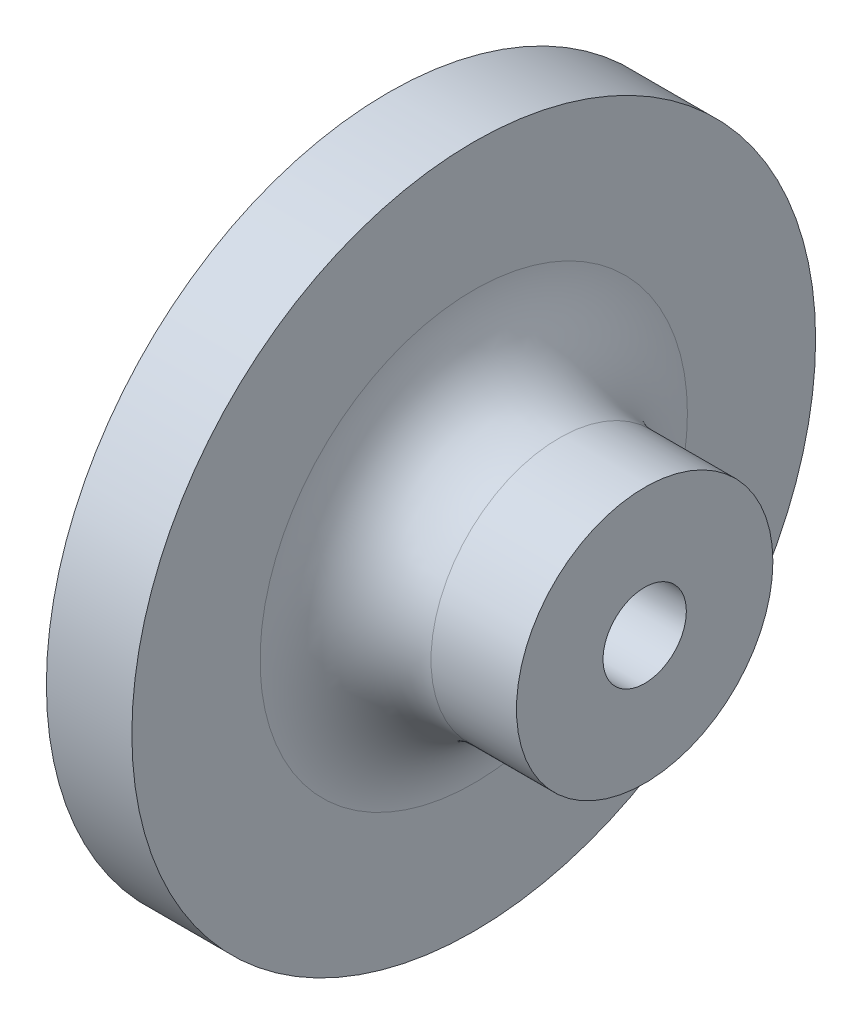
ISO-10303-21;
HEADER;
FILE_DESCRIPTION(('STEP AP214'),'2;1');
FILE_NAME('part.step','',(''),(''),'','','');
FILE_SCHEMA(('AUTOMOTIVE_DESIGN { 1 0 10303 214 1 1 1 1 }'));
ENDSEC;
DATA;
#1=APPLICATION_CONTEXT('core data for automotive mechanical design processes');
#2=APPLICATION_PROTOCOL_DEFINITION('international standard','automotive_design',2000,#1);
#3=PRODUCT_CONTEXT('',#1,'mechanical');
#4=PRODUCT('Part','Part','',(#3));
#5=PRODUCT_RELATED_PRODUCT_CATEGORY('part','',(#4));
#6=PRODUCT_DEFINITION_FORMATION('','',#4);
#7=PRODUCT_DEFINITION_CONTEXT('part definition',#1,'design');
#8=PRODUCT_DEFINITION('design','',#6,#7);
#9=PRODUCT_DEFINITION_SHAPE('','',#8);
#10=(LENGTH_UNIT() NAMED_UNIT(*) SI_UNIT(.MILLI.,.METRE.));
#11=(NAMED_UNIT(*) PLANE_ANGLE_UNIT() SI_UNIT($,.RADIAN.));
#12=(NAMED_UNIT(*) SI_UNIT($,.STERADIAN.) SOLID_ANGLE_UNIT());
#13=UNCERTAINTY_MEASURE_WITH_UNIT(LENGTH_MEASURE(1.E-05),#10,'distance_accuracy_value','');
#14=(GEOMETRIC_REPRESENTATION_CONTEXT(3) GLOBAL_UNCERTAINTY_ASSIGNED_CONTEXT((#13)) GLOBAL_UNIT_ASSIGNED_CONTEXT((#10,
#11,#12)) REPRESENTATION_CONTEXT('',''));
#15=CARTESIAN_POINT('',(0.,0.,0.));
#16=DIRECTION('',(0.,0.,1.));
#17=DIRECTION('',(1.,0.,0.));
#18=AXIS2_PLACEMENT_3D('',#15,#16,#17);
#19=CARTESIAN_POINT('',(10.,0.,32.));
#20=DIRECTION('',(-1.,0.,0.));
#21=DIRECTION('',(0.,0.,1.));
#22=AXIS2_PLACEMENT_3D('',#19,#20,#21);
#23=CYLINDRICAL_SURFACE('',#22,5.5);
#24=CARTESIAN_POINT('',(0.,0.,32.));
#25=DIRECTION('',(1.,0.,0.));
#26=DIRECTION('',(0.,0.,-1.));
#27=AXIS2_PLACEMENT_3D('',#24,#25,#26);
#28=CIRCLE('',#27,5.5);
#29=CARTESIAN_POINT('',(0.,0.,26.5));
#30=VERTEX_POINT('',#29);
#31=EDGE_CURVE('E61',#30,#30,#28,.T.);
#32=ORIENTED_EDGE('',*,*,#31,.F.);
#33=EDGE_LOOP('',(#32));
#34=FACE_BOUND('',#33,.T.);
#35=CARTESIAN_POINT('',(3.,0.,32.));
#36=DIRECTION('',(1.,0.,0.));
#37=DIRECTION('',(0.,0.,-1.));
#38=AXIS2_PLACEMENT_3D('',#35,#36,#37);
#39=CIRCLE('',#38,5.5);
#40=CARTESIAN_POINT('',(3.,0.,26.5));
#41=VERTEX_POINT('',#40);
#42=EDGE_CURVE('E146',#41,#41,#39,.T.);
#43=ORIENTED_EDGE('',*,*,#42,.T.);
#44=EDGE_LOOP('',(#43));
#45=FACE_BOUND('',#44,.T.);
#46=ADVANCED_FACE('F37',(#34,#45),#23,.F.);
#47=CARTESIAN_POINT('',(10.,-11.4292607123503,17.1050974451097));
#48=DIRECTION('',(-1.,0.,0.));
#49=DIRECTION('',(0.,0.,1.));
#50=AXIS2_PLACEMENT_3D('',#47,#48,#49);
#51=CYLINDRICAL_SURFACE('',#50,5.5);
#52=CARTESIAN_POINT('',(0.,-11.4292607123503,17.1050974451097));
#53=DIRECTION('',(1.,0.,0.));
#54=DIRECTION('',(0.,0.,-1.));
#55=AXIS2_PLACEMENT_3D('',#52,#53,#54);
#56=CIRCLE('',#55,5.5);
#57=CARTESIAN_POINT('',(0.,-11.4292607123503,11.6050974451097));
#58=VERTEX_POINT('',#57);
#59=EDGE_CURVE('E65',#58,#58,#56,.T.);
#60=ORIENTED_EDGE('',*,*,#59,.F.);
#61=EDGE_LOOP('',(#60));
#62=FACE_BOUND('',#61,.T.);
#63=CARTESIAN_POINT('',(3.,-11.4292607123503,17.1050974451097));
#64=DIRECTION('',(1.,0.,0.));
#65=DIRECTION('',(0.,0.,-1.));
#66=AXIS2_PLACEMENT_3D('',#63,#64,#65);
#67=CIRCLE('',#66,5.5);
#68=CARTESIAN_POINT('',(3.,-11.4292607123503,11.6050974451097));
#69=VERTEX_POINT('',#68);
#70=EDGE_CURVE('E149',#69,#69,#67,.T.);
#71=ORIENTED_EDGE('',*,*,#70,.T.);
#72=EDGE_LOOP('',(#71));
#73=FACE_BOUND('',#72,.T.);
#74=ADVANCED_FACE('F263',(#62,#73),#51,.F.);
#75=CARTESIAN_POINT('',(10.,12.2458698356829,29.5641450403612));
#76=DIRECTION('',(-1.,0.,0.));
#77=DIRECTION('',(0.,0.,1.));
#78=AXIS2_PLACEMENT_3D('',#75,#76,#77);
#79=CYLINDRICAL_SURFACE('',#78,5.5);
#80=CARTESIAN_POINT('',(0.,12.2458698356829,29.5641450403612));
#81=DIRECTION('',(1.,0.,0.));
#82=DIRECTION('',(0.,0.,-1.));
#83=AXIS2_PLACEMENT_3D('',#80,#81,#82);
#84=CIRCLE('',#83,5.5);
#85=CARTESIAN_POINT('',(0.,12.2458698356829,24.0641450403612));
#86=VERTEX_POINT('',#85);
#87=EDGE_CURVE('E68',#86,#86,#84,.T.);
#88=ORIENTED_EDGE('',*,*,#87,.F.);
#89=EDGE_LOOP('',(#88));
#90=FACE_BOUND('',#89,.T.);
#91=CARTESIAN_POINT('',(3.,12.2458698356829,29.5641450403612));
#92=DIRECTION('',(1.,0.,0.));
#93=DIRECTION('',(0.,0.,-1.));
#94=AXIS2_PLACEMENT_3D('',#91,#92,#93);
#95=CIRCLE('',#94,5.5);
#96=CARTESIAN_POINT('',(3.,12.2458698356829,24.0641450403612));
#97=VERTEX_POINT('',#96);
#98=EDGE_CURVE('E152',#97,#97,#95,.T.);
#99=ORIENTED_EDGE('',*,*,#98,.T.);
#100=EDGE_LOOP('',(#99));
#101=FACE_BOUND('',#100,.T.);
#102=ADVANCED_FACE('F270',(#90,#101),#79,.F.);
#103=CARTESIAN_POINT('',(10.,22.6274169979696,22.6274169979695));
#104=DIRECTION('',(-1.,0.,0.));
#105=DIRECTION('',(0.,0.,1.));
#106=AXIS2_PLACEMENT_3D('',#103,#104,#105);
#107=CYLINDRICAL_SURFACE('',#106,5.5);
#108=CARTESIAN_POINT('',(0.,22.6274169979696,22.6274169979695));
#109=DIRECTION('',(1.,0.,0.));
#110=DIRECTION('',(0.,0.,-1.));
#111=AXIS2_PLACEMENT_3D('',#108,#109,#110);
#112=CIRCLE('',#111,5.5);
#113=CARTESIAN_POINT('',(0.,22.6274169979696,17.1274169979695));
#114=VERTEX_POINT('',#113);
#115=EDGE_CURVE('E71',#114,#114,#112,.T.);
#116=ORIENTED_EDGE('',*,*,#115,.F.);
#117=EDGE_LOOP('',(#116));
#118=FACE_BOUND('',#117,.T.);
#119=CARTESIAN_POINT('',(3.,22.6274169979696,22.6274169979695));
#120=DIRECTION('',(1.,0.,0.));
#121=DIRECTION('',(0.,0.,-1.));
#122=AXIS2_PLACEMENT_3D('',#119,#120,#121);
#123=CIRCLE('',#122,5.5);
#124=CARTESIAN_POINT('',(3.,22.6274169979696,17.1274169979695));
#125=VERTEX_POINT('',#124);
#126=EDGE_CURVE('E155',#125,#125,#123,.T.);
#127=ORIENTED_EDGE('',*,*,#126,.T.);
#128=EDGE_LOOP('',(#127));
#129=FACE_BOUND('',#128,.T.);
#130=ADVANCED_FACE('F447',(#118,#129),#107,.F.);
#131=CARTESIAN_POINT('',(10.,29.5641450403612,12.2458698356828));
#132=DIRECTION('',(-1.,0.,0.));
#133=DIRECTION('',(0.,0.,1.));
#134=AXIS2_PLACEMENT_3D('',#131,#132,#133);
#135=CYLINDRICAL_SURFACE('',#134,5.5);
#136=CARTESIAN_POINT('',(0.,29.5641450403612,12.2458698356828));
#137=DIRECTION('',(1.,0.,0.));
#138=DIRECTION('',(0.,0.,-1.));
#139=AXIS2_PLACEMENT_3D('',#136,#137,#138);
#140=CIRCLE('',#139,5.5);
#141=CARTESIAN_POINT('',(0.,29.5641450403612,6.74586983568279));
#142=VERTEX_POINT('',#141);
#143=EDGE_CURVE('E74',#142,#142,#140,.T.);
#144=ORIENTED_EDGE('',*,*,#143,.F.);
#145=EDGE_LOOP('',(#144));
#146=FACE_BOUND('',#145,.T.);
#147=CARTESIAN_POINT('',(3.,29.5641450403612,12.2458698356828));
#148=DIRECTION('',(1.,0.,0.));
#149=DIRECTION('',(0.,0.,-1.));
#150=AXIS2_PLACEMENT_3D('',#147,#148,#149);
#151=CIRCLE('',#150,5.5);
#152=CARTESIAN_POINT('',(3.,29.5641450403612,6.74586983568279));
#153=VERTEX_POINT('',#152);
#154=EDGE_CURVE('E158',#153,#153,#151,.T.);
#155=ORIENTED_EDGE('',*,*,#154,.T.);
#156=EDGE_LOOP('',(#155));
#157=FACE_BOUND('',#156,.T.);
#158=ADVANCED_FACE('F443',(#146,#157),#135,.F.);
#159=CARTESIAN_POINT('',(10.,32.,-1.1172740284298E-13));
#160=DIRECTION('',(-1.,0.,0.));
#161=DIRECTION('',(0.,0.,1.));
#162=AXIS2_PLACEMENT_3D('',#159,#160,#161);
#163=CYLINDRICAL_SURFACE('',#162,5.5);
#164=CARTESIAN_POINT('',(0.,32.,-1.1172740284298E-13));
#165=DIRECTION('',(1.,0.,0.));
#166=DIRECTION('',(0.,0.,-1.));
#167=AXIS2_PLACEMENT_3D('',#164,#165,#166);
#168=CIRCLE('',#167,5.5);
#169=CARTESIAN_POINT('',(0.,32.,-5.50000000000011));
#170=VERTEX_POINT('',#169);
#171=EDGE_CURVE('E77',#170,#170,#168,.T.);
#172=ORIENTED_EDGE('',*,*,#171,.F.);
#173=EDGE_LOOP('',(#172));
#174=FACE_BOUND('',#173,.T.);
#175=CARTESIAN_POINT('',(3.,32.,-1.1172740284298E-13));
#176=DIRECTION('',(1.,0.,0.));
#177=DIRECTION('',(0.,0.,-1.));
#178=AXIS2_PLACEMENT_3D('',#175,#176,#177);
#179=CIRCLE('',#178,5.5);
#180=CARTESIAN_POINT('',(3.,32.,-5.50000000000011));
#181=VERTEX_POINT('',#180);
#182=EDGE_CURVE('E161',#181,#181,#179,.T.);
#183=ORIENTED_EDGE('',*,*,#182,.T.);
#184=EDGE_LOOP('',(#183));
#185=FACE_BOUND('',#184,.T.);
#186=ADVANCED_FACE('F439',(#174,#185),#163,.F.);
#187=CARTESIAN_POINT('',(10.,29.5641450403611,-12.245869835683));
#188=DIRECTION('',(-1.,0.,0.));
#189=DIRECTION('',(0.,0.,1.));
#190=AXIS2_PLACEMENT_3D('',#187,#188,#189);
#191=CYLINDRICAL_SURFACE('',#190,5.5);
#192=CARTESIAN_POINT('',(0.,29.5641450403611,-12.245869835683));
#193=DIRECTION('',(1.,0.,0.));
#194=DIRECTION('',(0.,0.,-1.));
#195=AXIS2_PLACEMENT_3D('',#192,#193,#194);
#196=CIRCLE('',#195,5.5);
#197=CARTESIAN_POINT('',(0.,29.5641450403611,-17.745869835683));
#198=VERTEX_POINT('',#197);
#199=EDGE_CURVE('E80',#198,#198,#196,.T.);
#200=ORIENTED_EDGE('',*,*,#199,.F.);
#201=EDGE_LOOP('',(#200));
#202=FACE_BOUND('',#201,.T.);
#203=CARTESIAN_POINT('',(3.,29.5641450403611,-12.245869835683));
#204=DIRECTION('',(1.,0.,0.));
#205=DIRECTION('',(0.,0.,-1.));
#206=AXIS2_PLACEMENT_3D('',#203,#204,#205);
#207=CIRCLE('',#206,5.5);
#208=CARTESIAN_POINT('',(3.,29.5641450403611,-17.745869835683));
#209=VERTEX_POINT('',#208);
#210=EDGE_CURVE('E164',#209,#209,#207,.T.);
#211=ORIENTED_EDGE('',*,*,#210,.T.);
#212=EDGE_LOOP('',(#211));
#213=FACE_BOUND('',#212,.T.);
#214=ADVANCED_FACE('F435',(#202,#213),#191,.F.);
#215=CARTESIAN_POINT('',(10.,22.6274169979694,-22.6274169979696));
#216=DIRECTION('',(-1.,0.,0.));
#217=DIRECTION('',(0.,0.,1.));
#218=AXIS2_PLACEMENT_3D('',#215,#216,#217);
#219=CYLINDRICAL_SURFACE('',#218,5.5);
#220=CARTESIAN_POINT('',(0.,22.6274169979694,-22.6274169979696));
#221=DIRECTION('',(1.,0.,0.));
#222=DIRECTION('',(0.,0.,-1.));
#223=AXIS2_PLACEMENT_3D('',#220,#221,#222);
#224=CIRCLE('',#223,5.5);
#225=CARTESIAN_POINT('',(0.,22.6274169979694,-28.1274169979696));
#226=VERTEX_POINT('',#225);
#227=EDGE_CURVE('E83',#226,#226,#224,.T.);
#228=ORIENTED_EDGE('',*,*,#227,.F.);
#229=EDGE_LOOP('',(#228));
#230=FACE_BOUND('',#229,.T.);
#231=CARTESIAN_POINT('',(3.,22.6274169979694,-22.6274169979696));
#232=DIRECTION('',(1.,0.,0.));
#233=DIRECTION('',(0.,0.,-1.));
#234=AXIS2_PLACEMENT_3D('',#231,#232,#233);
#235=CIRCLE('',#234,5.5);
#236=CARTESIAN_POINT('',(3.,22.6274169979694,-28.1274169979696));
#237=VERTEX_POINT('',#236);
#238=EDGE_CURVE('E167',#237,#237,#235,.T.);
#239=ORIENTED_EDGE('',*,*,#238,.T.);
#240=EDGE_LOOP('',(#239));
#241=FACE_BOUND('',#240,.T.);
#242=ADVANCED_FACE('F431',(#230,#241),#219,.F.);
#243=CARTESIAN_POINT('',(10.,12.2458698356827,-29.5641450403613));
#244=DIRECTION('',(-1.,0.,0.));
#245=DIRECTION('',(0.,0.,1.));
#246=AXIS2_PLACEMENT_3D('',#243,#244,#245);
#247=CYLINDRICAL_SURFACE('',#246,5.5);
#248=CARTESIAN_POINT('',(0.,12.2458698356827,-29.5641450403613));
#249=DIRECTION('',(1.,0.,0.));
#250=DIRECTION('',(0.,0.,-1.));
#251=AXIS2_PLACEMENT_3D('',#248,#249,#250);
#252=CIRCLE('',#251,5.5);
#253=CARTESIAN_POINT('',(0.,12.2458698356827,-35.0641450403613));
#254=VERTEX_POINT('',#253);
#255=EDGE_CURVE('E86',#254,#254,#252,.T.);
#256=ORIENTED_EDGE('',*,*,#255,.F.);
#257=EDGE_LOOP('',(#256));
#258=FACE_BOUND('',#257,.T.);
#259=CARTESIAN_POINT('',(3.,12.2458698356827,-29.5641450403613));
#260=DIRECTION('',(1.,0.,0.));
#261=DIRECTION('',(0.,0.,-1.));
#262=AXIS2_PLACEMENT_3D('',#259,#260,#261);
#263=CIRCLE('',#262,5.5);
#264=CARTESIAN_POINT('',(3.,12.2458698356827,-35.0641450403613));
#265=VERTEX_POINT('',#264);
#266=EDGE_CURVE('E170',#265,#265,#263,.T.);
#267=ORIENTED_EDGE('',*,*,#266,.T.);
#268=EDGE_LOOP('',(#267));
#269=FACE_BOUND('',#268,.T.);
#270=ADVANCED_FACE('F427',(#258,#269),#247,.F.);
#271=CARTESIAN_POINT('',(10.,-2.23454805685961E-13,-32.));
#272=DIRECTION('',(-1.,0.,0.));
#273=DIRECTION('',(0.,0.,1.));
#274=AXIS2_PLACEMENT_3D('',#271,#272,#273);
#275=CYLINDRICAL_SURFACE('',#274,5.5);
#276=CARTESIAN_POINT('',(0.,-2.23454805685961E-13,-32.));
#277=DIRECTION('',(1.,0.,0.));
#278=DIRECTION('',(0.,0.,-1.));
#279=AXIS2_PLACEMENT_3D('',#276,#277,#278);
#280=CIRCLE('',#279,5.5);
#281=CARTESIAN_POINT('',(0.,-2.23454805685961E-13,-37.5));
#282=VERTEX_POINT('',#281);
#283=EDGE_CURVE('E89',#282,#282,#280,.T.);
#284=ORIENTED_EDGE('',*,*,#283,.F.);
#285=EDGE_LOOP('',(#284));
#286=FACE_BOUND('',#285,.T.);
#287=CARTESIAN_POINT('',(3.,-2.23454805685961E-13,-32.));
#288=DIRECTION('',(1.,0.,0.));
#289=DIRECTION('',(0.,0.,-1.));
#290=AXIS2_PLACEMENT_3D('',#287,#288,#289);
#291=CIRCLE('',#290,5.5);
#292=CARTESIAN_POINT('',(3.,-2.23454805685961E-13,-37.5));
#293=VERTEX_POINT('',#292);
#294=EDGE_CURVE('E173',#293,#293,#291,.T.);
#295=ORIENTED_EDGE('',*,*,#294,.T.);
#296=EDGE_LOOP('',(#295));
#297=FACE_BOUND('',#296,.T.);
#298=ADVANCED_FACE('F423',(#286,#297),#275,.F.);
#299=CARTESIAN_POINT('',(10.,-12.2458698356831,-29.5641450403611));
#300=DIRECTION('',(-1.,0.,0.));
#301=DIRECTION('',(0.,0.,1.));
#302=AXIS2_PLACEMENT_3D('',#299,#300,#301);
#303=CYLINDRICAL_SURFACE('',#302,5.5);
#304=CARTESIAN_POINT('',(0.,-12.2458698356831,-29.5641450403611));
#305=DIRECTION('',(1.,0.,0.));
#306=DIRECTION('',(0.,0.,-1.));
#307=AXIS2_PLACEMENT_3D('',#304,#305,#306);
#308=CIRCLE('',#307,5.5);
#309=CARTESIAN_POINT('',(0.,-12.2458698356831,-35.0641450403611));
#310=VERTEX_POINT('',#309);
#311=EDGE_CURVE('E92',#310,#310,#308,.T.);
#312=ORIENTED_EDGE('',*,*,#311,.F.);
#313=EDGE_LOOP('',(#312));
#314=FACE_BOUND('',#313,.T.);
#315=CARTESIAN_POINT('',(3.,-12.2458698356831,-29.5641450403611));
#316=DIRECTION('',(1.,0.,0.));
#317=DIRECTION('',(0.,0.,-1.));
#318=AXIS2_PLACEMENT_3D('',#315,#316,#317);
#319=CIRCLE('',#318,5.5);
#320=CARTESIAN_POINT('',(3.,-12.2458698356831,-35.0641450403611));
#321=VERTEX_POINT('',#320);
#322=EDGE_CURVE('E176',#321,#321,#319,.T.);
#323=ORIENTED_EDGE('',*,*,#322,.T.);
#324=EDGE_LOOP('',(#323));
#325=FACE_BOUND('',#324,.T.);
#326=ADVANCED_FACE('F419',(#314,#325),#303,.F.);
#327=CARTESIAN_POINT('',(10.,-22.6274169979697,-22.6274169979693));
#328=DIRECTION('',(-1.,0.,0.));
#329=DIRECTION('',(0.,0.,1.));
#330=AXIS2_PLACEMENT_3D('',#327,#328,#329);
#331=CYLINDRICAL_SURFACE('',#330,5.5);
#332=CARTESIAN_POINT('',(0.,-22.6274169979697,-22.6274169979693));
#333=DIRECTION('',(1.,0.,0.));
#334=DIRECTION('',(0.,0.,-1.));
#335=AXIS2_PLACEMENT_3D('',#332,#333,#334);
#336=CIRCLE('',#335,5.5);
#337=CARTESIAN_POINT('',(0.,-22.6274169979697,-28.1274169979693));
#338=VERTEX_POINT('',#337);
#339=EDGE_CURVE('E95',#338,#338,#336,.T.);
#340=ORIENTED_EDGE('',*,*,#339,.F.);
#341=EDGE_LOOP('',(#340));
#342=FACE_BOUND('',#341,.T.);
#343=CARTESIAN_POINT('',(3.,-22.6274169979697,-22.6274169979693));
#344=DIRECTION('',(1.,0.,0.));
#345=DIRECTION('',(0.,0.,-1.));
#346=AXIS2_PLACEMENT_3D('',#343,#344,#345);
#347=CIRCLE('',#346,5.5);
#348=CARTESIAN_POINT('',(3.,-22.6274169979697,-28.1274169979693));
#349=VERTEX_POINT('',#348);
#350=EDGE_CURVE('E179',#349,#349,#347,.T.);
#351=ORIENTED_EDGE('',*,*,#350,.T.);
#352=EDGE_LOOP('',(#351));
#353=FACE_BOUND('',#352,.T.);
#354=ADVANCED_FACE('F415',(#342,#353),#331,.F.);
#355=CARTESIAN_POINT('',(10.,-29.5641450403613,-12.2458698356826));
#356=DIRECTION('',(-1.,0.,0.));
#357=DIRECTION('',(0.,0.,1.));
#358=AXIS2_PLACEMENT_3D('',#355,#356,#357);
#359=CYLINDRICAL_SURFACE('',#358,5.5);
#360=CARTESIAN_POINT('',(0.,-29.5641450403613,-12.2458698356826));
#361=DIRECTION('',(1.,0.,0.));
#362=DIRECTION('',(0.,0.,-1.));
#363=AXIS2_PLACEMENT_3D('',#360,#361,#362);
#364=CIRCLE('',#363,5.5);
#365=CARTESIAN_POINT('',(0.,-29.5641450403613,-17.7458698356826));
#366=VERTEX_POINT('',#365);
#367=EDGE_CURVE('E98',#366,#366,#364,.T.);
#368=ORIENTED_EDGE('',*,*,#367,.F.);
#369=EDGE_LOOP('',(#368));
#370=FACE_BOUND('',#369,.T.);
#371=CARTESIAN_POINT('',(3.,-29.5641450403613,-12.2458698356826));
#372=DIRECTION('',(1.,0.,0.));
#373=DIRECTION('',(0.,0.,-1.));
#374=AXIS2_PLACEMENT_3D('',#371,#372,#373);
#375=CIRCLE('',#374,5.5);
#376=CARTESIAN_POINT('',(3.,-29.5641450403613,-17.7458698356826));
#377=VERTEX_POINT('',#376);
#378=EDGE_CURVE('E182',#377,#377,#375,.T.);
#379=ORIENTED_EDGE('',*,*,#378,.T.);
#380=EDGE_LOOP('',(#379));
#381=FACE_BOUND('',#380,.T.);
#382=ADVANCED_FACE('F411',(#370,#381),#359,.F.);
#383=CARTESIAN_POINT('',(10.,-32.,3.35182208528941E-13));
#384=DIRECTION('',(-1.,0.,0.));
#385=DIRECTION('',(0.,0.,1.));
#386=AXIS2_PLACEMENT_3D('',#383,#384,#385);
#387=CYLINDRICAL_SURFACE('',#386,5.5);
#388=CARTESIAN_POINT('',(0.,-32.,3.35182208528941E-13));
#389=DIRECTION('',(1.,0.,0.));
#390=DIRECTION('',(0.,0.,-1.));
#391=AXIS2_PLACEMENT_3D('',#388,#389,#390);
#392=CIRCLE('',#391,5.5);
#393=CARTESIAN_POINT('',(0.,-32.,-5.49999999999966));
#394=VERTEX_POINT('',#393);
#395=EDGE_CURVE('E101',#394,#394,#392,.T.);
#396=ORIENTED_EDGE('',*,*,#395,.F.);
#397=EDGE_LOOP('',(#396));
#398=FACE_BOUND('',#397,.T.);
#399=CARTESIAN_POINT('',(3.,-32.,3.35182208528941E-13));
#400=DIRECTION('',(1.,0.,0.));
#401=DIRECTION('',(0.,0.,-1.));
#402=AXIS2_PLACEMENT_3D('',#399,#400,#401);
#403=CIRCLE('',#402,5.5);
#404=CARTESIAN_POINT('',(3.,-32.,-5.49999999999966));
#405=VERTEX_POINT('',#404);
#406=EDGE_CURVE('E185',#405,#405,#403,.T.);
#407=ORIENTED_EDGE('',*,*,#406,.T.);
#408=EDGE_LOOP('',(#407));
#409=FACE_BOUND('',#408,.T.);
#410=ADVANCED_FACE('F407',(#398,#409),#387,.F.);
#411=CARTESIAN_POINT('',(10.,-29.564145040361,12.2458698356832));
#412=DIRECTION('',(-1.,0.,0.));
#413=DIRECTION('',(0.,0.,1.));
#414=AXIS2_PLACEMENT_3D('',#411,#412,#413);
#415=CYLINDRICAL_SURFACE('',#414,5.5);
#416=CARTESIAN_POINT('',(0.,-29.564145040361,12.2458698356832));
#417=DIRECTION('',(1.,0.,0.));
#418=DIRECTION('',(0.,0.,-1.));
#419=AXIS2_PLACEMENT_3D('',#416,#417,#418);
#420=CIRCLE('',#419,5.5);
#421=CARTESIAN_POINT('',(0.,-29.564145040361,6.74586983568319));
#422=VERTEX_POINT('',#421);
#423=EDGE_CURVE('E104',#422,#422,#420,.T.);
#424=ORIENTED_EDGE('',*,*,#423,.F.);
#425=EDGE_LOOP('',(#424));
#426=FACE_BOUND('',#425,.T.);
#427=CARTESIAN_POINT('',(3.,-29.564145040361,12.2458698356832));
#428=DIRECTION('',(1.,0.,0.));
#429=DIRECTION('',(0.,0.,-1.));
#430=AXIS2_PLACEMENT_3D('',#427,#428,#429);
#431=CIRCLE('',#430,5.5);
#432=CARTESIAN_POINT('',(3.,-29.564145040361,6.74586983568319));
#433=VERTEX_POINT('',#432);
#434=EDGE_CURVE('E188',#433,#433,#431,.T.);
#435=ORIENTED_EDGE('',*,*,#434,.T.);
#436=EDGE_LOOP('',(#435));
#437=FACE_BOUND('',#436,.T.);
#438=ADVANCED_FACE('F403',(#426,#437),#415,.F.);
#439=CARTESIAN_POINT('',(10.,-22.6274169979692,22.6274169979698));
#440=DIRECTION('',(-1.,0.,0.));
#441=DIRECTION('',(0.,0.,1.));
#442=AXIS2_PLACEMENT_3D('',#439,#440,#441);
#443=CYLINDRICAL_SURFACE('',#442,5.5);
#444=CARTESIAN_POINT('',(0.,-22.6274169979692,22.6274169979698));
#445=DIRECTION('',(1.,0.,0.));
#446=DIRECTION('',(0.,0.,-1.));
#447=AXIS2_PLACEMENT_3D('',#444,#445,#446);
#448=CIRCLE('',#447,5.5);
#449=CARTESIAN_POINT('',(0.,-22.6274169979692,17.1274169979698));
#450=VERTEX_POINT('',#449);
#451=EDGE_CURVE('E107',#450,#450,#448,.T.);
#452=ORIENTED_EDGE('',*,*,#451,.F.);
#453=EDGE_LOOP('',(#452));
#454=FACE_BOUND('',#453,.T.);
#455=CARTESIAN_POINT('',(3.,-22.6274169979692,22.6274169979698));
#456=DIRECTION('',(1.,0.,0.));
#457=DIRECTION('',(0.,0.,-1.));
#458=AXIS2_PLACEMENT_3D('',#455,#456,#457);
#459=CIRCLE('',#458,5.5);
#460=CARTESIAN_POINT('',(3.,-22.6274169979692,17.1274169979698));
#461=VERTEX_POINT('',#460);
#462=EDGE_CURVE('E191',#461,#461,#459,.T.);
#463=ORIENTED_EDGE('',*,*,#462,.T.);
#464=EDGE_LOOP('',(#463));
#465=FACE_BOUND('',#464,.T.);
#466=ADVANCED_FACE('F399',(#454,#465),#443,.F.);
#467=CARTESIAN_POINT('',(10.,-12.2458698356825,29.5641450403613));
#468=DIRECTION('',(-1.,0.,0.));
#469=DIRECTION('',(0.,0.,1.));
#470=AXIS2_PLACEMENT_3D('',#467,#468,#469);
#471=CYLINDRICAL_SURFACE('',#470,5.5);
#472=CARTESIAN_POINT('',(0.,-12.2458698356825,29.5641450403613));
#473=DIRECTION('',(1.,0.,0.));
#474=DIRECTION('',(0.,0.,-1.));
#475=AXIS2_PLACEMENT_3D('',#472,#473,#474);
#476=CIRCLE('',#475,5.5);
#477=CARTESIAN_POINT('',(0.,-12.2458698356825,24.0641450403613));
#478=VERTEX_POINT('',#477);
#479=EDGE_CURVE('E110',#478,#478,#476,.T.);
#480=ORIENTED_EDGE('',*,*,#479,.F.);
#481=EDGE_LOOP('',(#480));
#482=FACE_BOUND('',#481,.T.);
#483=CARTESIAN_POINT('',(3.,-12.2458698356825,29.5641450403613));
#484=DIRECTION('',(1.,0.,0.));
#485=DIRECTION('',(0.,0.,-1.));
#486=AXIS2_PLACEMENT_3D('',#483,#484,#485);
#487=CIRCLE('',#486,5.5);
#488=CARTESIAN_POINT('',(3.,-12.2458698356825,24.0641450403613));
#489=VERTEX_POINT('',#488);
#490=EDGE_CURVE('E194',#489,#489,#487,.T.);
#491=ORIENTED_EDGE('',*,*,#490,.T.);
#492=EDGE_LOOP('',(#491));
#493=FACE_BOUND('',#492,.T.);
#494=ADVANCED_FACE('F395',(#482,#493),#471,.F.);
#495=CARTESIAN_POINT('',(10.,5.52768324201422,8.2727625941879));
#496=DIRECTION('',(-1.,0.,0.));
#497=DIRECTION('',(0.,0.,1.));
#498=AXIS2_PLACEMENT_3D('',#495,#496,#497);
#499=CYLINDRICAL_SURFACE('',#498,5.5);
#500=CARTESIAN_POINT('',(0.,5.52768324201422,8.2727625941879));
#501=DIRECTION('',(1.,0.,0.));
#502=DIRECTION('',(0.,0.,-1.));
#503=AXIS2_PLACEMENT_3D('',#500,#501,#502);
#504=CIRCLE('',#503,5.5);
#505=CARTESIAN_POINT('',(0.,5.52768324201422,2.7727625941879));
#506=VERTEX_POINT('',#505);
#507=EDGE_CURVE('E113',#506,#506,#504,.T.);
#508=ORIENTED_EDGE('',*,*,#507,.F.);
#509=EDGE_LOOP('',(#508));
#510=FACE_BOUND('',#509,.T.);
#511=CARTESIAN_POINT('',(3.,5.52768324201422,8.2727625941879));
#512=DIRECTION('',(1.,0.,0.));
#513=DIRECTION('',(0.,0.,-1.));
#514=AXIS2_PLACEMENT_3D('',#511,#512,#513);
#515=CIRCLE('',#514,5.5);
#516=CARTESIAN_POINT('',(3.,5.52768324201422,2.7727625941879));
#517=VERTEX_POINT('',#516);
#518=EDGE_CURVE('E197',#517,#517,#515,.T.);
#519=ORIENTED_EDGE('',*,*,#518,.T.);
#520=EDGE_LOOP('',(#519));
#521=FACE_BOUND('',#520,.T.);
#522=ADVANCED_FACE('F391',(#510,#521),#499,.F.);
#523=CARTESIAN_POINT('',(10.,4.01342264264188,20.1768381499456));
#524=DIRECTION('',(-1.,0.,0.));
#525=DIRECTION('',(0.,0.,1.));
#526=AXIS2_PLACEMENT_3D('',#523,#524,#525);
#527=CYLINDRICAL_SURFACE('',#526,5.5);
#528=CARTESIAN_POINT('',(0.,4.01342264264188,20.1768381499456));
#529=DIRECTION('',(1.,0.,0.));
#530=DIRECTION('',(0.,0.,-1.));
#531=AXIS2_PLACEMENT_3D('',#528,#529,#530);
#532=CIRCLE('',#531,5.5);
#533=CARTESIAN_POINT('',(0.,4.01342264264188,14.6768381499456));
#534=VERTEX_POINT('',#533);
#535=EDGE_CURVE('E116',#534,#534,#532,.T.);
#536=ORIENTED_EDGE('',*,*,#535,.F.);
#537=EDGE_LOOP('',(#536));
#538=FACE_BOUND('',#537,.T.);
#539=CARTESIAN_POINT('',(3.,4.01342264264188,20.1768381499456));
#540=DIRECTION('',(1.,0.,0.));
#541=DIRECTION('',(0.,0.,-1.));
#542=AXIS2_PLACEMENT_3D('',#539,#540,#541);
#543=CIRCLE('',#542,5.5);
#544=CARTESIAN_POINT('',(3.,4.01342264264188,14.6768381499456));
#545=VERTEX_POINT('',#544);
#546=EDGE_CURVE('E200',#545,#545,#543,.T.);
#547=ORIENTED_EDGE('',*,*,#546,.T.);
#548=EDGE_LOOP('',(#547));
#549=FACE_BOUND('',#548,.T.);
#550=ADVANCED_FACE('F387',(#538,#549),#527,.F.);
#551=CARTESIAN_POINT('',(10.,17.1050974451097,11.4292607123502));
#552=DIRECTION('',(-1.,0.,0.));
#553=DIRECTION('',(0.,0.,1.));
#554=AXIS2_PLACEMENT_3D('',#551,#552,#553);
#555=CYLINDRICAL_SURFACE('',#554,5.5);
#556=CARTESIAN_POINT('',(0.,17.1050974451097,11.4292607123502));
#557=DIRECTION('',(1.,0.,0.));
#558=DIRECTION('',(0.,0.,-1.));
#559=AXIS2_PLACEMENT_3D('',#556,#557,#558);
#560=CIRCLE('',#559,5.5);
#561=CARTESIAN_POINT('',(0.,17.1050974451097,5.92926071235025));
#562=VERTEX_POINT('',#561);
#563=EDGE_CURVE('E119',#562,#562,#560,.T.);
#564=ORIENTED_EDGE('',*,*,#563,.F.);
#565=EDGE_LOOP('',(#564));
#566=FACE_BOUND('',#565,.T.);
#567=CARTESIAN_POINT('',(3.,17.1050974451097,11.4292607123502));
#568=DIRECTION('',(1.,0.,0.));
#569=DIRECTION('',(0.,0.,-1.));
#570=AXIS2_PLACEMENT_3D('',#567,#568,#569);
#571=CIRCLE('',#570,5.5);
#572=CARTESIAN_POINT('',(3.,17.1050974451097,5.92926071235025));
#573=VERTEX_POINT('',#572);
#574=EDGE_CURVE('E203',#573,#573,#571,.T.);
#575=ORIENTED_EDGE('',*,*,#574,.T.);
#576=EDGE_LOOP('',(#575));
#577=FACE_BOUND('',#576,.T.);
#578=ADVANCED_FACE('F383',(#566,#577),#555,.F.);
#579=CARTESIAN_POINT('',(10.,20.1768381499456,-4.01342264264196));
#580=DIRECTION('',(-1.,0.,0.));
#581=DIRECTION('',(0.,0.,1.));
#582=AXIS2_PLACEMENT_3D('',#579,#580,#581);
#583=CYLINDRICAL_SURFACE('',#582,5.5);
#584=CARTESIAN_POINT('',(0.,20.1768381499456,-4.01342264264196));
#585=DIRECTION('',(1.,0.,0.));
#586=DIRECTION('',(0.,0.,-1.));
#587=AXIS2_PLACEMENT_3D('',#584,#585,#586);
#588=CIRCLE('',#587,5.5);
#589=CARTESIAN_POINT('',(0.,20.1768381499456,-9.51342264264196));
#590=VERTEX_POINT('',#589);
#591=EDGE_CURVE('E122',#590,#590,#588,.T.);
#592=ORIENTED_EDGE('',*,*,#591,.F.);
#593=EDGE_LOOP('',(#592));
#594=FACE_BOUND('',#593,.T.);
#595=CARTESIAN_POINT('',(3.,20.1768381499456,-4.01342264264196));
#596=DIRECTION('',(1.,0.,0.));
#597=DIRECTION('',(0.,0.,-1.));
#598=AXIS2_PLACEMENT_3D('',#595,#596,#597);
#599=CIRCLE('',#598,5.5);
#600=CARTESIAN_POINT('',(3.,20.1768381499456,-9.51342264264196));
#601=VERTEX_POINT('',#600);
#602=EDGE_CURVE('E206',#601,#601,#599,.T.);
#603=ORIENTED_EDGE('',*,*,#602,.T.);
#604=EDGE_LOOP('',(#603));
#605=FACE_BOUND('',#604,.T.);
#606=ADVANCED_FACE('F379',(#594,#605),#583,.F.);
#607=CARTESIAN_POINT('',(10.,11.4292607123502,-17.1050974451097));
#608=DIRECTION('',(-1.,0.,0.));
#609=DIRECTION('',(0.,0.,1.));
#610=AXIS2_PLACEMENT_3D('',#607,#608,#609);
#611=CYLINDRICAL_SURFACE('',#610,5.5);
#612=CARTESIAN_POINT('',(0.,11.4292607123502,-17.1050974451097));
#613=DIRECTION('',(1.,0.,0.));
#614=DIRECTION('',(0.,0.,-1.));
#615=AXIS2_PLACEMENT_3D('',#612,#613,#614);
#616=CIRCLE('',#615,5.5);
#617=CARTESIAN_POINT('',(0.,11.4292607123502,-22.6050974451097));
#618=VERTEX_POINT('',#617);
#619=EDGE_CURVE('E125',#618,#618,#616,.T.);
#620=ORIENTED_EDGE('',*,*,#619,.F.);
#621=EDGE_LOOP('',(#620));
#622=FACE_BOUND('',#621,.T.);
#623=CARTESIAN_POINT('',(3.,11.4292607123502,-17.1050974451097));
#624=DIRECTION('',(1.,0.,0.));
#625=DIRECTION('',(0.,0.,-1.));
#626=AXIS2_PLACEMENT_3D('',#623,#624,#625);
#627=CIRCLE('',#626,5.5);
#628=CARTESIAN_POINT('',(3.,11.4292607123502,-22.6050974451097));
#629=VERTEX_POINT('',#628);
#630=EDGE_CURVE('E209',#629,#629,#627,.T.);
#631=ORIENTED_EDGE('',*,*,#630,.T.);
#632=EDGE_LOOP('',(#631));
#633=FACE_BOUND('',#632,.T.);
#634=ADVANCED_FACE('F375',(#622,#633),#611,.F.);
#635=CARTESIAN_POINT('',(10.,-4.01342264264202,-20.1768381499456));
#636=DIRECTION('',(-1.,0.,0.));
#637=DIRECTION('',(0.,0.,1.));
#638=AXIS2_PLACEMENT_3D('',#635,#636,#637);
#639=CYLINDRICAL_SURFACE('',#638,5.5);
#640=CARTESIAN_POINT('',(0.,-4.01342264264202,-20.1768381499456));
#641=DIRECTION('',(1.,0.,0.));
#642=DIRECTION('',(0.,0.,-1.));
#643=AXIS2_PLACEMENT_3D('',#640,#641,#642);
#644=CIRCLE('',#643,5.5);
#645=CARTESIAN_POINT('',(0.,-4.01342264264202,-25.6768381499456));
#646=VERTEX_POINT('',#645);
#647=EDGE_CURVE('E128',#646,#646,#644,.T.);
#648=ORIENTED_EDGE('',*,*,#647,.F.);
#649=EDGE_LOOP('',(#648));
#650=FACE_BOUND('',#649,.T.);
#651=CARTESIAN_POINT('',(3.,-4.01342264264202,-20.1768381499456));
#652=DIRECTION('',(1.,0.,0.));
#653=DIRECTION('',(0.,0.,-1.));
#654=AXIS2_PLACEMENT_3D('',#651,#652,#653);
#655=CIRCLE('',#654,5.5);
#656=CARTESIAN_POINT('',(3.,-4.01342264264202,-25.6768381499456));
#657=VERTEX_POINT('',#656);
#658=EDGE_CURVE('E212',#657,#657,#655,.T.);
#659=ORIENTED_EDGE('',*,*,#658,.T.);
#660=EDGE_LOOP('',(#659));
#661=FACE_BOUND('',#660,.T.);
#662=ADVANCED_FACE('F371',(#650,#661),#639,.F.);
#663=CARTESIAN_POINT('',(10.,-17.1050974451098,-11.4292607123501));
#664=DIRECTION('',(-1.,0.,0.));
#665=DIRECTION('',(0.,0.,1.));
#666=AXIS2_PLACEMENT_3D('',#663,#664,#665);
#667=CYLINDRICAL_SURFACE('',#666,5.5);
#668=CARTESIAN_POINT('',(0.,-17.1050974451098,-11.4292607123501));
#669=DIRECTION('',(1.,0.,0.));
#670=DIRECTION('',(0.,0.,-1.));
#671=AXIS2_PLACEMENT_3D('',#668,#669,#670);
#672=CIRCLE('',#671,5.5);
#673=CARTESIAN_POINT('',(0.,-17.1050974451098,-16.9292607123501));
#674=VERTEX_POINT('',#673);
#675=EDGE_CURVE('E131',#674,#674,#672,.T.);
#676=ORIENTED_EDGE('',*,*,#675,.F.);
#677=EDGE_LOOP('',(#676));
#678=FACE_BOUND('',#677,.T.);
#679=CARTESIAN_POINT('',(3.,-17.1050974451098,-11.4292607123501));
#680=DIRECTION('',(1.,0.,0.));
#681=DIRECTION('',(0.,0.,-1.));
#682=AXIS2_PLACEMENT_3D('',#679,#680,#681);
#683=CIRCLE('',#682,5.5);
#684=CARTESIAN_POINT('',(3.,-17.1050974451098,-16.9292607123501));
#685=VERTEX_POINT('',#684);
#686=EDGE_CURVE('E215',#685,#685,#683,.T.);
#687=ORIENTED_EDGE('',*,*,#686,.T.);
#688=EDGE_LOOP('',(#687));
#689=FACE_BOUND('',#688,.T.);
#690=ADVANCED_FACE('F367',(#678,#689),#667,.F.);
#691=CARTESIAN_POINT('',(10.,-20.1768381499456,4.01342264264209));
#692=DIRECTION('',(-1.,0.,0.));
#693=DIRECTION('',(0.,0.,1.));
#694=AXIS2_PLACEMENT_3D('',#691,#692,#693);
#695=CYLINDRICAL_SURFACE('',#694,5.5);
#696=CARTESIAN_POINT('',(0.,-20.1768381499456,4.01342264264209));
#697=DIRECTION('',(1.,0.,0.));
#698=DIRECTION('',(0.,0.,-1.));
#699=AXIS2_PLACEMENT_3D('',#696,#697,#698);
#700=CIRCLE('',#699,5.5);
#701=CARTESIAN_POINT('',(0.,-20.1768381499456,-1.48657735735791));
#702=VERTEX_POINT('',#701);
#703=EDGE_CURVE('E134',#702,#702,#700,.T.);
#704=ORIENTED_EDGE('',*,*,#703,.F.);
#705=EDGE_LOOP('',(#704));
#706=FACE_BOUND('',#705,.T.);
#707=CARTESIAN_POINT('',(3.,-20.1768381499456,4.01342264264209));
#708=DIRECTION('',(1.,0.,0.));
#709=DIRECTION('',(0.,0.,-1.));
#710=AXIS2_PLACEMENT_3D('',#707,#708,#709);
#711=CIRCLE('',#710,5.5);
#712=CARTESIAN_POINT('',(3.,-20.1768381499456,-1.48657735735791));
#713=VERTEX_POINT('',#712);
#714=EDGE_CURVE('E218',#713,#713,#711,.T.);
#715=ORIENTED_EDGE('',*,*,#714,.T.);
#716=EDGE_LOOP('',(#715));
#717=FACE_BOUND('',#716,.T.);
#718=ADVANCED_FACE('F363',(#706,#717),#695,.F.);
#719=CARTESIAN_POINT('',(10.,8.27276259418788,-5.52768324201424));
#720=DIRECTION('',(-1.,0.,0.));
#721=DIRECTION('',(0.,0.,1.));
#722=AXIS2_PLACEMENT_3D('',#719,#720,#721);
#723=CYLINDRICAL_SURFACE('',#722,5.5);
#724=CARTESIAN_POINT('',(0.,8.27276259418788,-5.52768324201424));
#725=DIRECTION('',(1.,0.,0.));
#726=DIRECTION('',(0.,0.,-1.));
#727=AXIS2_PLACEMENT_3D('',#724,#725,#726);
#728=CIRCLE('',#727,5.5);
#729=CARTESIAN_POINT('',(0.,8.27276259418788,-11.0276832420142));
#730=VERTEX_POINT('',#729);
#731=EDGE_CURVE('E137',#730,#730,#728,.T.);
#732=ORIENTED_EDGE('',*,*,#731,.F.);
#733=EDGE_LOOP('',(#732));
#734=FACE_BOUND('',#733,.T.);
#735=CARTESIAN_POINT('',(3.,8.27276259418788,-5.52768324201424));
#736=DIRECTION('',(1.,0.,0.));
#737=DIRECTION('',(0.,0.,-1.));
#738=AXIS2_PLACEMENT_3D('',#735,#736,#737);
#739=CIRCLE('',#738,5.5);
#740=CARTESIAN_POINT('',(3.,8.27276259418788,-11.0276832420142));
#741=VERTEX_POINT('',#740);
#742=EDGE_CURVE('E221',#741,#741,#739,.T.);
#743=ORIENTED_EDGE('',*,*,#742,.T.);
#744=EDGE_LOOP('',(#743));
#745=FACE_BOUND('',#744,.T.);
#746=ADVANCED_FACE('F357',(#734,#745),#723,.F.);
#747=CARTESIAN_POINT('',(10.,-5.52768324201427,-8.27276259418786));
#748=DIRECTION('',(-1.,0.,0.));
#749=DIRECTION('',(0.,0.,1.));
#750=AXIS2_PLACEMENT_3D('',#747,#748,#749);
#751=CYLINDRICAL_SURFACE('',#750,5.5);
#752=CARTESIAN_POINT('',(0.,-5.52768324201427,-8.27276259418786));
#753=DIRECTION('',(1.,0.,0.));
#754=DIRECTION('',(0.,0.,-1.));
#755=AXIS2_PLACEMENT_3D('',#752,#753,#754);
#756=CIRCLE('',#755,5.5);
#757=CARTESIAN_POINT('',(0.,-5.52768324201427,-13.7727625941879));
#758=VERTEX_POINT('',#757);
#759=EDGE_CURVE('E140',#758,#758,#756,.T.);
#760=ORIENTED_EDGE('',*,*,#759,.F.);
#761=EDGE_LOOP('',(#760));
#762=FACE_BOUND('',#761,.T.);
#763=CARTESIAN_POINT('',(3.,-5.52768324201427,-8.27276259418786));
#764=DIRECTION('',(1.,0.,0.));
#765=DIRECTION('',(0.,0.,-1.));
#766=AXIS2_PLACEMENT_3D('',#763,#764,#765);
#767=CIRCLE('',#766,5.5);
#768=CARTESIAN_POINT('',(3.,-5.52768324201427,-13.7727625941879));
#769=VERTEX_POINT('',#768);
#770=EDGE_CURVE('E58',#769,#769,#767,.T.);
#771=ORIENTED_EDGE('',*,*,#770,.T.);
#772=EDGE_LOOP('',(#771));
#773=FACE_BOUND('',#772,.T.);
#774=ADVANCED_FACE('F351',(#762,#773),#751,.F.);
#775=CARTESIAN_POINT('',(10.,-8.27276259418784,5.5276832420143));
#776=DIRECTION('',(-1.,0.,0.));
#777=DIRECTION('',(0.,0.,1.));
#778=AXIS2_PLACEMENT_3D('',#775,#776,#777);
#779=CYLINDRICAL_SURFACE('',#778,5.5);
#780=CARTESIAN_POINT('',(0.,-8.27276259418784,5.5276832420143));
#781=DIRECTION('',(1.,0.,0.));
#782=DIRECTION('',(0.,0.,-1.));
#783=AXIS2_PLACEMENT_3D('',#780,#781,#782);
#784=CIRCLE('',#783,5.5);
#785=CARTESIAN_POINT('',(0.,-8.27276259418784,0.0276832420143015));
#786=VERTEX_POINT('',#785);
#787=EDGE_CURVE('E143',#786,#786,#784,.T.);
#788=ORIENTED_EDGE('',*,*,#787,.F.);
#789=EDGE_LOOP('',(#788));
#790=FACE_BOUND('',#789,.T.);
#791=CARTESIAN_POINT('',(3.,-8.27276259418784,5.5276832420143));
#792=DIRECTION('',(1.,0.,0.));
#793=DIRECTION('',(0.,0.,-1.));
#794=AXIS2_PLACEMENT_3D('',#791,#792,#793);
#795=CIRCLE('',#794,5.5);
#796=CARTESIAN_POINT('',(3.,-8.27276259418784,0.0276832420143015));
#797=VERTEX_POINT('',#796);
#798=EDGE_CURVE('E55',#797,#797,#795,.T.);
#799=ORIENTED_EDGE('',*,*,#798,.T.);
#800=EDGE_LOOP('',(#799));
#801=FACE_BOUND('',#800,.T.);
#802=ADVANCED_FACE('F280',(#790,#801),#779,.F.);
#803=CARTESIAN_POINT('',(10.,0.,0.));
#804=DIRECTION('',(1.,0.,0.));
#805=DIRECTION('',(0.,0.,-1.));
#806=AXIS2_PLACEMENT_3D('',#803,#804,#805);
#807=PLANE('',#806);
#808=CARTESIAN_POINT('',(10.,0.,0.));
#809=DIRECTION('',(1.,0.,0.));
#810=DIRECTION('',(0.,0.,-1.));
#811=AXIS2_PLACEMENT_3D('',#808,#809,#810);
#812=CIRCLE('',#811,25.);
#813=CARTESIAN_POINT('',(10.,0.,-25.));
#814=VERTEX_POINT('',#813);
#815=EDGE_CURVE('E10',#814,#814,#812,.F.);
#816=ORIENTED_EDGE('',*,*,#815,.T.);
#817=EDGE_LOOP('',(#816));
#818=FACE_BOUND('',#817,.T.);
#819=CARTESIAN_POINT('',(10.,0.,0.));
#820=DIRECTION('',(1.,0.,0.));
#821=DIRECTION('',(0.,0.,-1.));
#822=AXIS2_PLACEMENT_3D('',#819,#820,#821);
#823=CIRCLE('',#822,40.);
#824=CARTESIAN_POINT('',(10.,0.,-40.));
#825=VERTEX_POINT('',#824);
#826=EDGE_CURVE('E48',#825,#825,#823,.T.);
#827=ORIENTED_EDGE('',*,*,#826,.T.);
#828=EDGE_LOOP('',(#827));
#829=FACE_BOUND('',#828,.T.);
#830=ADVANCED_FACE('F277',(#818,#829),#807,.T.);
#831=CARTESIAN_POINT('',(0.,0.,0.));
#832=DIRECTION('',(1.,0.,0.));
#833=DIRECTION('',(0.,0.,-1.));
#834=AXIS2_PLACEMENT_3D('',#831,#832,#833);
#835=PLANE('',#834);
#836=CARTESIAN_POINT('',(0.,0.,0.));
#837=DIRECTION('',(1.,0.,0.));
#838=DIRECTION('',(0.,0.,-1.));
#839=AXIS2_PLACEMENT_3D('',#836,#837,#838);
#840=CIRCLE('',#839,40.);
#841=CARTESIAN_POINT('',(0.,0.,-40.));
#842=VERTEX_POINT('',#841);
#843=EDGE_CURVE('E52',#842,#842,#840,.T.);
#844=ORIENTED_EDGE('',*,*,#843,.F.);
#845=EDGE_LOOP('',(#844));
#846=FACE_BOUND('',#845,.T.);
#847=ORIENTED_EDGE('',*,*,#31,.T.);
#848=EDGE_LOOP('',(#847));
#849=FACE_BOUND('',#848,.T.);
#850=ORIENTED_EDGE('',*,*,#59,.T.);
#851=EDGE_LOOP('',(#850));
#852=FACE_BOUND('',#851,.T.);
#853=ORIENTED_EDGE('',*,*,#87,.T.);
#854=EDGE_LOOP('',(#853));
#855=FACE_BOUND('',#854,.T.);
#856=ORIENTED_EDGE('',*,*,#115,.T.);
#857=EDGE_LOOP('',(#856));
#858=FACE_BOUND('',#857,.T.);
#859=ORIENTED_EDGE('',*,*,#143,.T.);
#860=EDGE_LOOP('',(#859));
#861=FACE_BOUND('',#860,.T.);
#862=ORIENTED_EDGE('',*,*,#171,.T.);
#863=EDGE_LOOP('',(#862));
#864=FACE_BOUND('',#863,.T.);
#865=ORIENTED_EDGE('',*,*,#199,.T.);
#866=EDGE_LOOP('',(#865));
#867=FACE_BOUND('',#866,.T.);
#868=ORIENTED_EDGE('',*,*,#227,.T.);
#869=EDGE_LOOP('',(#868));
#870=FACE_BOUND('',#869,.T.);
#871=ORIENTED_EDGE('',*,*,#255,.T.);
#872=EDGE_LOOP('',(#871));
#873=FACE_BOUND('',#872,.T.);
#874=ORIENTED_EDGE('',*,*,#283,.T.);
#875=EDGE_LOOP('',(#874));
#876=FACE_BOUND('',#875,.T.);
#877=ORIENTED_EDGE('',*,*,#311,.T.);
#878=EDGE_LOOP('',(#877));
#879=FACE_BOUND('',#878,.T.);
#880=ORIENTED_EDGE('',*,*,#339,.T.);
#881=EDGE_LOOP('',(#880));
#882=FACE_BOUND('',#881,.T.);
#883=ORIENTED_EDGE('',*,*,#367,.T.);
#884=EDGE_LOOP('',(#883));
#885=FACE_BOUND('',#884,.T.);
#886=ORIENTED_EDGE('',*,*,#395,.T.);
#887=EDGE_LOOP('',(#886));
#888=FACE_BOUND('',#887,.T.);
#889=ORIENTED_EDGE('',*,*,#423,.T.);
#890=EDGE_LOOP('',(#889));
#891=FACE_BOUND('',#890,.T.);
#892=ORIENTED_EDGE('',*,*,#451,.T.);
#893=EDGE_LOOP('',(#892));
#894=FACE_BOUND('',#893,.T.);
#895=ORIENTED_EDGE('',*,*,#479,.T.);
#896=EDGE_LOOP('',(#895));
#897=FACE_BOUND('',#896,.T.);
#898=ORIENTED_EDGE('',*,*,#507,.T.);
#899=EDGE_LOOP('',(#898));
#900=FACE_BOUND('',#899,.T.);
#901=ORIENTED_EDGE('',*,*,#535,.T.);
#902=EDGE_LOOP('',(#901));
#903=FACE_BOUND('',#902,.T.);
#904=ORIENTED_EDGE('',*,*,#563,.T.);
#905=EDGE_LOOP('',(#904));
#906=FACE_BOUND('',#905,.T.);
#907=ORIENTED_EDGE('',*,*,#591,.T.);
#908=EDGE_LOOP('',(#907));
#909=FACE_BOUND('',#908,.T.);
#910=ORIENTED_EDGE('',*,*,#619,.T.);
#911=EDGE_LOOP('',(#910));
#912=FACE_BOUND('',#911,.T.);
#913=ORIENTED_EDGE('',*,*,#647,.T.);
#914=EDGE_LOOP('',(#913));
#915=FACE_BOUND('',#914,.T.);
#916=ORIENTED_EDGE('',*,*,#675,.T.);
#917=EDGE_LOOP('',(#916));
#918=FACE_BOUND('',#917,.T.);
#919=ORIENTED_EDGE('',*,*,#703,.T.);
#920=EDGE_LOOP('',(#919));
#921=FACE_BOUND('',#920,.T.);
#922=ORIENTED_EDGE('',*,*,#731,.T.);
#923=EDGE_LOOP('',(#922));
#924=FACE_BOUND('',#923,.T.);
#925=ORIENTED_EDGE('',*,*,#759,.T.);
#926=EDGE_LOOP('',(#925));
#927=FACE_BOUND('',#926,.T.);
#928=ORIENTED_EDGE('',*,*,#787,.T.);
#929=EDGE_LOOP('',(#928));
#930=FACE_BOUND('',#929,.T.);
#931=ADVANCED_FACE('F279',(#846,#849,#852,#855,#858,#861,#864,#867,#870,#873,#876,#879,#882,
#885,#888,#891,#894,#897,#900,#903,#906,#909,#912,#915,#918,#921,#924,#927,#930),#835,.F.);
#932=CARTESIAN_POINT('',(10.,0.,0.));
#933=DIRECTION('',(-1.,0.,0.));
#934=DIRECTION('',(0.,0.,1.));
#935=AXIS2_PLACEMENT_3D('',#932,#933,#934);
#936=CYLINDRICAL_SURFACE('',#935,40.);
#937=ORIENTED_EDGE('',*,*,#826,.F.);
#938=EDGE_LOOP('',(#937));
#939=FACE_BOUND('',#938,.T.);
#940=ORIENTED_EDGE('',*,*,#843,.T.);
#941=EDGE_LOOP('',(#940));
#942=FACE_BOUND('',#941,.T.);
#943=ADVANCED_FACE('F281',(#939,#942),#936,.T.);
#944=CARTESIAN_POINT('',(3.,0.,0.));
#945=DIRECTION('',(1.,0.,0.));
#946=DIRECTION('',(0.,0.,-1.));
#947=AXIS2_PLACEMENT_3D('',#944,#945,#946);
#948=PLANE('',#947);
#949=ORIENTED_EDGE('',*,*,#798,.F.);
#950=EDGE_LOOP('',(#949));
#951=FACE_BOUND('',#950,.T.);
#952=ADVANCED_FACE('F261',(#951),#948,.F.);
#953=ORIENTED_EDGE('',*,*,#770,.F.);
#954=EDGE_LOOP('',(#953));
#955=FACE_BOUND('',#954,.T.);
#956=ADVANCED_FACE('F289',(#955),#948,.F.);
#957=ORIENTED_EDGE('',*,*,#742,.F.);
#958=EDGE_LOOP('',(#957));
#959=FACE_BOUND('',#958,.T.);
#960=ADVANCED_FACE('F611',(#959),#948,.F.);
#961=ORIENTED_EDGE('',*,*,#714,.F.);
#962=EDGE_LOOP('',(#961));
#963=FACE_BOUND('',#962,.T.);
#964=ADVANCED_FACE('F604',(#963),#948,.F.);
#965=ORIENTED_EDGE('',*,*,#686,.F.);
#966=EDGE_LOOP('',(#965));
#967=FACE_BOUND('',#966,.T.);
#968=ADVANCED_FACE('F597',(#967),#948,.F.);
#969=ORIENTED_EDGE('',*,*,#658,.F.);
#970=EDGE_LOOP('',(#969));
#971=FACE_BOUND('',#970,.T.);
#972=ADVANCED_FACE('F590',(#971),#948,.F.);
#973=ORIENTED_EDGE('',*,*,#630,.F.);
#974=EDGE_LOOP('',(#973));
#975=FACE_BOUND('',#974,.T.);
#976=ADVANCED_FACE('F583',(#975),#948,.F.);
#977=ORIENTED_EDGE('',*,*,#602,.F.);
#978=EDGE_LOOP('',(#977));
#979=FACE_BOUND('',#978,.T.);
#980=ADVANCED_FACE('F576',(#979),#948,.F.);
#981=ORIENTED_EDGE('',*,*,#574,.F.);
#982=EDGE_LOOP('',(#981));
#983=FACE_BOUND('',#982,.T.);
#984=ADVANCED_FACE('F569',(#983),#948,.F.);
#985=ORIENTED_EDGE('',*,*,#546,.F.);
#986=EDGE_LOOP('',(#985));
#987=FACE_BOUND('',#986,.T.);
#988=ADVANCED_FACE('F562',(#987),#948,.F.);
#989=ORIENTED_EDGE('',*,*,#518,.F.);
#990=EDGE_LOOP('',(#989));
#991=FACE_BOUND('',#990,.T.);
#992=ADVANCED_FACE('F555',(#991),#948,.F.);
#993=ORIENTED_EDGE('',*,*,#490,.F.);
#994=EDGE_LOOP('',(#993));
#995=FACE_BOUND('',#994,.T.);
#996=ADVANCED_FACE('F548',(#995),#948,.F.);
#997=ORIENTED_EDGE('',*,*,#462,.F.);
#998=EDGE_LOOP('',(#997));
#999=FACE_BOUND('',#998,.T.);
#1000=ADVANCED_FACE('F541',(#999),#948,.F.);
#1001=ORIENTED_EDGE('',*,*,#434,.F.);
#1002=EDGE_LOOP('',(#1001));
#1003=FACE_BOUND('',#1002,.T.);
#1004=ADVANCED_FACE('F534',(#1003),#948,.F.);
#1005=ORIENTED_EDGE('',*,*,#406,.F.);
#1006=EDGE_LOOP('',(#1005));
#1007=FACE_BOUND('',#1006,.T.);
#1008=ADVANCED_FACE('F527',(#1007),#948,.F.);
#1009=ORIENTED_EDGE('',*,*,#378,.F.);
#1010=EDGE_LOOP('',(#1009));
#1011=FACE_BOUND('',#1010,.T.);
#1012=ADVANCED_FACE('F520',(#1011),#948,.F.);
#1013=ORIENTED_EDGE('',*,*,#350,.F.);
#1014=EDGE_LOOP('',(#1013));
#1015=FACE_BOUND('',#1014,.T.);
#1016=ADVANCED_FACE('F513',(#1015),#948,.F.);
#1017=ORIENTED_EDGE('',*,*,#322,.F.);
#1018=EDGE_LOOP('',(#1017));
#1019=FACE_BOUND('',#1018,.T.);
#1020=ADVANCED_FACE('F506',(#1019),#948,.F.);
#1021=ORIENTED_EDGE('',*,*,#294,.F.);
#1022=EDGE_LOOP('',(#1021));
#1023=FACE_BOUND('',#1022,.T.);
#1024=ADVANCED_FACE('F499',(#1023),#948,.F.);
#1025=ORIENTED_EDGE('',*,*,#266,.F.);
#1026=EDGE_LOOP('',(#1025));
#1027=FACE_BOUND('',#1026,.T.);
#1028=ADVANCED_FACE('F492',(#1027),#948,.F.);
#1029=ORIENTED_EDGE('',*,*,#238,.F.);
#1030=EDGE_LOOP('',(#1029));
#1031=FACE_BOUND('',#1030,.T.);
#1032=ADVANCED_FACE('F485',(#1031),#948,.F.);
#1033=ORIENTED_EDGE('',*,*,#210,.F.);
#1034=EDGE_LOOP('',(#1033));
#1035=FACE_BOUND('',#1034,.T.);
#1036=ADVANCED_FACE('F478',(#1035),#948,.F.);
#1037=ORIENTED_EDGE('',*,*,#182,.F.);
#1038=EDGE_LOOP('',(#1037));
#1039=FACE_BOUND('',#1038,.T.);
#1040=ADVANCED_FACE('F471',(#1039),#948,.F.);
#1041=ORIENTED_EDGE('',*,*,#154,.F.);
#1042=EDGE_LOOP('',(#1041));
#1043=FACE_BOUND('',#1042,.T.);
#1044=ADVANCED_FACE('F466',(#1043),#948,.F.);
#1045=ORIENTED_EDGE('',*,*,#126,.F.);
#1046=EDGE_LOOP('',(#1045));
#1047=FACE_BOUND('',#1046,.T.);
#1048=ADVANCED_FACE('F460',(#1047),#948,.F.);
#1049=ORIENTED_EDGE('',*,*,#98,.F.);
#1050=EDGE_LOOP('',(#1049));
#1051=FACE_BOUND('',#1050,.T.);
#1052=ADVANCED_FACE('F458',(#1051),#948,.F.);
#1053=ORIENTED_EDGE('',*,*,#70,.F.);
#1054=EDGE_LOOP('',(#1053));
#1055=FACE_BOUND('',#1054,.T.);
#1056=ADVANCED_FACE('F258',(#1055),#948,.F.);
#1057=ORIENTED_EDGE('',*,*,#42,.F.);
#1058=EDGE_LOOP('',(#1057));
#1059=FACE_BOUND('',#1058,.T.);
#1060=ADVANCED_FACE('F251',(#1059),#948,.F.);
#1061=CARTESIAN_POINT('',(30.,0.,0.));
#1062=DIRECTION('',(-1.,0.,0.));
#1063=DIRECTION('',(0.,0.,1.));
#1064=AXIS2_PLACEMENT_3D('',#1061,#1062,#1063);
#1065=CYLINDRICAL_SURFACE('',#1064,15.);
#1066=CARTESIAN_POINT('',(20.,0.,0.));
#1067=DIRECTION('',(1.,0.,0.));
#1068=DIRECTION('',(0.,0.,-1.));
#1069=AXIS2_PLACEMENT_3D('',#1066,#1067,#1068);
#1070=CIRCLE('',#1069,15.);
#1071=CARTESIAN_POINT('',(20.,0.,-15.));
#1072=VERTEX_POINT('',#1071);
#1073=EDGE_CURVE('E44',#1072,#1072,#1070,.T.);
#1074=ORIENTED_EDGE('',*,*,#1073,.T.);
#1075=EDGE_LOOP('',(#1074));
#1076=FACE_BOUND('',#1075,.T.);
#1077=CARTESIAN_POINT('',(30.,0.,0.));
#1078=DIRECTION('',(1.,0.,0.));
#1079=DIRECTION('',(0.,0.,-1.));
#1080=AXIS2_PLACEMENT_3D('',#1077,#1078,#1079);
#1081=CIRCLE('',#1080,15.);
#1082=CARTESIAN_POINT('',(30.,0.,-15.));
#1083=VERTEX_POINT('',#1082);
#1084=EDGE_CURVE('E59',#1083,#1083,#1081,.T.);
#1085=ORIENTED_EDGE('',*,*,#1084,.F.);
#1086=EDGE_LOOP('',(#1085));
#1087=FACE_BOUND('',#1086,.T.);
#1088=ADVANCED_FACE('F246',(#1076,#1087),#1065,.T.);
#1089=CARTESIAN_POINT('',(30.,0.,0.));
#1090=DIRECTION('',(1.,0.,0.));
#1091=DIRECTION('',(0.,0.,-1.));
#1092=AXIS2_PLACEMENT_3D('',#1089,#1090,#1091);
#1093=PLANE('',#1092);
#1094=CARTESIAN_POINT('',(30.,0.,0.));
#1095=DIRECTION('',(1.,0.,0.));
#1096=DIRECTION('',(0.,0.,-1.));
#1097=AXIS2_PLACEMENT_3D('',#1094,#1095,#1096);
#1098=CIRCLE('',#1097,4.875);
#1099=CARTESIAN_POINT('',(30.,0.,-4.875));
#1100=VERTEX_POINT('',#1099);
#1101=EDGE_CURVE('E229',#1100,#1100,#1098,.T.);
#1102=ORIENTED_EDGE('',*,*,#1101,.F.);
#1103=EDGE_LOOP('',(#1102));
#1104=FACE_BOUND('',#1103,.T.);
#1105=ORIENTED_EDGE('',*,*,#1084,.T.);
#1106=EDGE_LOOP('',(#1105));
#1107=FACE_BOUND('',#1106,.T.);
#1108=ADVANCED_FACE('F243',(#1104,#1107),#1093,.T.);
#1109=CARTESIAN_POINT('',(20.,0.,0.));
#1110=DIRECTION('',(1.,0.,0.));
#1111=DIRECTION('',(0.,0.,-1.));
#1112=AXIS2_PLACEMENT_3D('',#1109,#1110,#1111);
#1113=TOROIDAL_SURFACE('',#1112,25.,10.);
#1114=ORIENTED_EDGE('',*,*,#815,.F.);
#1115=EDGE_LOOP('',(#1114));
#1116=FACE_BOUND('',#1115,.T.);
#1117=ORIENTED_EDGE('',*,*,#1073,.F.);
#1118=EDGE_LOOP('',(#1117));
#1119=FACE_BOUND('',#1118,.T.);
#1120=ADVANCED_FACE('F39',(#1116,#1119),#1113,.F.);
#1121=CARTESIAN_POINT('',(14.,0.,0.));
#1122=DIRECTION('',(1.,0.,0.));
#1123=DIRECTION('',(0.,0.,-1.));
#1124=AXIS2_PLACEMENT_3D('',#1121,#1122,#1123);
#1125=CYLINDRICAL_SURFACE('',#1124,4.875);
#1126=CARTESIAN_POINT('',(14.,0.,0.));
#1127=DIRECTION('',(1.,0.,0.));
#1128=DIRECTION('',(0.,0.,-1.));
#1129=AXIS2_PLACEMENT_3D('',#1126,#1127,#1128);
#1130=CIRCLE('',#1129,4.875);
#1131=CARTESIAN_POINT('',(14.,0.,-4.875));
#1132=VERTEX_POINT('',#1131);
#1133=EDGE_CURVE('E228',#1132,#1132,#1130,.T.);
#1134=ORIENTED_EDGE('',*,*,#1133,.F.);
#1135=EDGE_LOOP('',(#1134));
#1136=FACE_BOUND('',#1135,.T.);
#1137=ORIENTED_EDGE('',*,*,#1101,.T.);
#1138=EDGE_LOOP('',(#1137));
#1139=FACE_BOUND('',#1138,.T.);
#1140=ADVANCED_FACE('F237',(#1136,#1139),#1125,.F.);
#1141=CARTESIAN_POINT('',(14.,0.,0.));
#1142=DIRECTION('',(1.,0.,0.));
#1143=DIRECTION('',(0.,0.,-1.));
#1144=AXIS2_PLACEMENT_3D('',#1141,#1142,#1143);
#1145=PLANE('',#1144);
#1146=ORIENTED_EDGE('',*,*,#1133,.T.);
#1147=EDGE_LOOP('',(#1146));
#1148=FACE_BOUND('',#1147,.T.);
#1149=ADVANCED_FACE('F235',(#1148),#1145,.T.);
#1150=CLOSED_SHELL('',(#46,#74,#102,#130,#158,#186,#214,#242,#270,#298,#326,#354,#382,#410,#438,
#466,#494,#522,#550,#578,#606,#634,#662,#690,#718,#746,#774,#802,#830,#931,#943,#952,#956,#960,
#964,#968,#972,#976,#980,#984,#988,#992,#996,#1000,#1004,#1008,#1012,#1016,#1020,#1024,#1028,
#1032,#1036,#1040,#1044,#1048,#1052,#1056,#1060,#1088,#1108,#1120,#1140,#1149));
#1151=MANIFOLD_SOLID_BREP('B2',#1150);
#1152=ADVANCED_BREP_SHAPE_REPRESENTATION('',(#18,#1151),#14);
#1153=SHAPE_DEFINITION_REPRESENTATION(#9,#1152);
ENDSEC;
END-ISO-10303-21;
